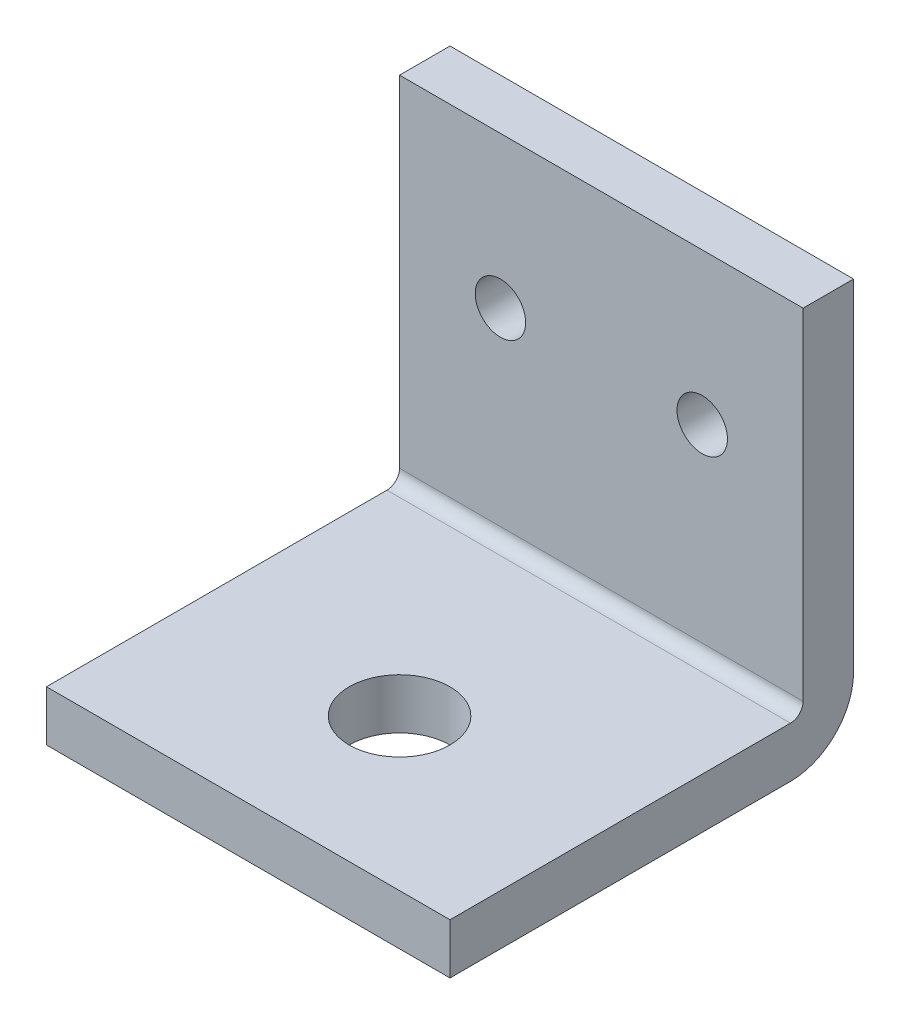
ISO-10303-21;
HEADER;
FILE_DESCRIPTION(('STEP AP214'),'2;1');
FILE_NAME('part.step','',(''),(''),'','','');
FILE_SCHEMA(('AUTOMOTIVE_DESIGN { 1 0 10303 214 1 1 1 1 }'));
ENDSEC;
DATA;
#1=APPLICATION_CONTEXT('core data for automotive mechanical design processes');
#2=APPLICATION_PROTOCOL_DEFINITION('international standard','automotive_design',2000,#1);
#3=PRODUCT_CONTEXT('',#1,'mechanical');
#4=PRODUCT('Part','Part','',(#3));
#5=PRODUCT_RELATED_PRODUCT_CATEGORY('part','',(#4));
#6=PRODUCT_DEFINITION_FORMATION('','',#4);
#7=PRODUCT_DEFINITION_CONTEXT('part definition',#1,'design');
#8=PRODUCT_DEFINITION('design','',#6,#7);
#9=PRODUCT_DEFINITION_SHAPE('','',#8);
#10=(LENGTH_UNIT() NAMED_UNIT(*) SI_UNIT(.MILLI.,.METRE.));
#11=(NAMED_UNIT(*) PLANE_ANGLE_UNIT() SI_UNIT($,.RADIAN.));
#12=(NAMED_UNIT(*) SI_UNIT($,.STERADIAN.) SOLID_ANGLE_UNIT());
#13=UNCERTAINTY_MEASURE_WITH_UNIT(LENGTH_MEASURE(1.E-05),#10,'distance_accuracy_value','');
#14=(GEOMETRIC_REPRESENTATION_CONTEXT(3) GLOBAL_UNCERTAINTY_ASSIGNED_CONTEXT((#13)) GLOBAL_UNIT_ASSIGNED_CONTEXT((#10,
#11,#12)) REPRESENTATION_CONTEXT('',''));
#15=CARTESIAN_POINT('',(0.,0.,0.));
#16=DIRECTION('',(0.,0.,1.));
#17=DIRECTION('',(1.,0.,0.));
#18=AXIS2_PLACEMENT_3D('',#15,#16,#17);
#19=CARTESIAN_POINT('',(20.,5.,-20.));
#20=DIRECTION('',(-1.,0.,0.));
#21=DIRECTION('',(0.,0.,1.));
#22=AXIS2_PLACEMENT_3D('',#19,#20,#21);
#23=PLANE('',#22);
#24=DIRECTION('',(0.,0.,-1.));
#25=VECTOR('',#24,1.);
#26=CARTESIAN_POINT('',(20.,0.,-20.));
#27=LINE('',#26,#25);
#28=CARTESIAN_POINT('',(20.,0.,20.));
#29=VERTEX_POINT('',#28);
#30=CARTESIAN_POINT('',(20.,0.,-13.75));
#31=VERTEX_POINT('',#30);
#32=EDGE_CURVE('E127',#29,#31,#27,.T.);
#33=ORIENTED_EDGE('',*,*,#32,.T.);
#34=CARTESIAN_POINT('',(20.,6.25,-13.75));
#35=DIRECTION('',(-1.,0.,0.));
#36=DIRECTION('',(0.,0.,1.));
#37=AXIS2_PLACEMENT_3D('',#34,#35,#36);
#38=CIRCLE('',#37,6.25);
#39=CARTESIAN_POINT('',(20.,6.25,-20.));
#40=VERTEX_POINT('',#39);
#41=EDGE_CURVE('E11',#31,#40,#38,.F.);
#42=ORIENTED_EDGE('',*,*,#41,.T.);
#43=DIRECTION('',(0.,-1.,0.));
#44=VECTOR('',#43,1.);
#45=CARTESIAN_POINT('',(20.,5.,-20.));
#46=LINE('',#45,#44);
#47=CARTESIAN_POINT('',(20.,40.,-20.));
#48=VERTEX_POINT('',#47);
#49=EDGE_CURVE('E152',#48,#40,#46,.T.);
#50=ORIENTED_EDGE('',*,*,#49,.F.);
#51=DIRECTION('',(0.,0.,-1.));
#52=VECTOR('',#51,1.);
#53=CARTESIAN_POINT('',(20.,40.,-20.));
#54=LINE('',#53,#52);
#55=CARTESIAN_POINT('',(20.,40.,-15.));
#56=VERTEX_POINT('',#55);
#57=EDGE_CURVE('E113',#56,#48,#54,.T.);
#58=ORIENTED_EDGE('',*,*,#57,.F.);
#59=DIRECTION('',(0.,-1.,0.));
#60=VECTOR('',#59,1.);
#61=CARTESIAN_POINT('',(20.,40.,-15.));
#62=LINE('',#61,#60);
#63=CARTESIAN_POINT('',(20.,6.25,-15.));
#64=VERTEX_POINT('',#63);
#65=EDGE_CURVE('E109',#56,#64,#62,.T.);
#66=ORIENTED_EDGE('',*,*,#65,.T.);
#67=CARTESIAN_POINT('',(20.,6.25,-13.75));
#68=DIRECTION('',(-1.,0.,0.));
#69=DIRECTION('',(0.,0.,1.));
#70=AXIS2_PLACEMENT_3D('',#67,#68,#69);
#71=CIRCLE('',#70,1.25);
#72=CARTESIAN_POINT('',(20.,5.,-13.75));
#73=VERTEX_POINT('',#72);
#74=EDGE_CURVE('E162',#64,#73,#71,.T.);
#75=ORIENTED_EDGE('',*,*,#74,.T.);
#76=DIRECTION('',(0.,0.,-1.));
#77=VECTOR('',#76,1.);
#78=CARTESIAN_POINT('',(20.,5.,-20.));
#79=LINE('',#78,#77);
#80=CARTESIAN_POINT('',(20.,5.,20.));
#81=VERTEX_POINT('',#80);
#82=EDGE_CURVE('E134',#81,#73,#79,.T.);
#83=ORIENTED_EDGE('',*,*,#82,.F.);
#84=DIRECTION('',(0.,-1.,0.));
#85=VECTOR('',#84,1.);
#86=CARTESIAN_POINT('',(20.,5.,20.));
#87=LINE('',#86,#85);
#88=EDGE_CURVE('E141',#81,#29,#87,.T.);
#89=ORIENTED_EDGE('',*,*,#88,.T.);
#90=EDGE_LOOP('',(#33,#42,#50,#58,#66,#75,#83,#89));
#91=FACE_BOUND('',#90,.T.);
#92=ADVANCED_FACE('F37',(#91),#23,.F.);
#93=CARTESIAN_POINT('',(-20.,5.,-20.));
#94=DIRECTION('',(0.,0.,1.));
#95=DIRECTION('',(1.,0.,0.));
#96=AXIS2_PLACEMENT_3D('',#93,#94,#95);
#97=PLANE('',#96);
#98=CARTESIAN_POINT('',(-9.99999999999999,25.,-20.));
#99=DIRECTION('',(0.,0.,1.));
#100=DIRECTION('',(1.,0.,0.));
#101=AXIS2_PLACEMENT_3D('',#98,#99,#100);
#102=CIRCLE('',#101,2.5);
#103=CARTESIAN_POINT('',(-7.49999999999999,25.,-20.));
#104=VERTEX_POINT('',#103);
#105=EDGE_CURVE('E190',#104,#104,#102,.T.);
#106=ORIENTED_EDGE('',*,*,#105,.T.);
#107=EDGE_LOOP('',(#106));
#108=FACE_BOUND('',#107,.T.);
#109=CARTESIAN_POINT('',(10.,25.,-20.));
#110=DIRECTION('',(0.,0.,1.));
#111=DIRECTION('',(1.,0.,0.));
#112=AXIS2_PLACEMENT_3D('',#109,#110,#111);
#113=CIRCLE('',#112,2.5);
#114=CARTESIAN_POINT('',(12.5,25.,-20.));
#115=VERTEX_POINT('',#114);
#116=EDGE_CURVE('E193',#115,#115,#113,.T.);
#117=ORIENTED_EDGE('',*,*,#116,.T.);
#118=EDGE_LOOP('',(#117));
#119=FACE_BOUND('',#118,.T.);
#120=ORIENTED_EDGE('',*,*,#49,.T.);
#121=DIRECTION('',(-1.,0.,0.));
#122=VECTOR('',#121,1.);
#123=CARTESIAN_POINT('',(-20.,6.25,-20.));
#124=LINE('',#123,#122);
#125=CARTESIAN_POINT('',(-20.,6.25,-20.));
#126=VERTEX_POINT('',#125);
#127=EDGE_CURVE('E165',#40,#126,#124,.T.);
#128=ORIENTED_EDGE('',*,*,#127,.T.);
#129=DIRECTION('',(0.,-1.,0.));
#130=VECTOR('',#129,1.);
#131=CARTESIAN_POINT('',(-20.,5.,-20.));
#132=LINE('',#131,#130);
#133=CARTESIAN_POINT('',(-20.,40.,-20.));
#134=VERTEX_POINT('',#133);
#135=EDGE_CURVE('E150',#134,#126,#132,.T.);
#136=ORIENTED_EDGE('',*,*,#135,.F.);
#137=DIRECTION('',(-1.,0.,0.));
#138=VECTOR('',#137,1.);
#139=CARTESIAN_POINT('',(-20.,40.,-20.));
#140=LINE('',#139,#138);
#141=EDGE_CURVE('E120',#48,#134,#140,.T.);
#142=ORIENTED_EDGE('',*,*,#141,.F.);
#143=EDGE_LOOP('',(#120,#128,#136,#142));
#144=FACE_BOUND('',#143,.T.);
#145=ADVANCED_FACE('F170',(#108,#119,#144),#97,.F.);
#146=CARTESIAN_POINT('',(-20.,5.,-20.));
#147=DIRECTION('',(1.,0.,0.));
#148=DIRECTION('',(0.,0.,-1.));
#149=AXIS2_PLACEMENT_3D('',#146,#147,#148);
#150=PLANE('',#149);
#151=ORIENTED_EDGE('',*,*,#135,.T.);
#152=CARTESIAN_POINT('',(-20.,6.25,-13.75));
#153=DIRECTION('',(1.,0.,0.));
#154=DIRECTION('',(0.,0.,-1.));
#155=AXIS2_PLACEMENT_3D('',#152,#153,#154);
#156=CIRCLE('',#155,6.25);
#157=CARTESIAN_POINT('',(-20.,0.,-13.75));
#158=VERTEX_POINT('',#157);
#159=EDGE_CURVE('E59',#126,#158,#156,.F.);
#160=ORIENTED_EDGE('',*,*,#159,.T.);
#161=DIRECTION('',(0.,0.,1.));
#162=VECTOR('',#161,1.);
#163=CARTESIAN_POINT('',(-20.,0.,-20.));
#164=LINE('',#163,#162);
#165=CARTESIAN_POINT('',(-20.,0.,20.));
#166=VERTEX_POINT('',#165);
#167=EDGE_CURVE('E129',#158,#166,#164,.T.);
#168=ORIENTED_EDGE('',*,*,#167,.T.);
#169=DIRECTION('',(0.,-1.,0.));
#170=VECTOR('',#169,1.);
#171=CARTESIAN_POINT('',(-20.,5.,20.));
#172=LINE('',#171,#170);
#173=CARTESIAN_POINT('',(-20.,5.,20.));
#174=VERTEX_POINT('',#173);
#175=EDGE_CURVE('E147',#174,#166,#172,.T.);
#176=ORIENTED_EDGE('',*,*,#175,.F.);
#177=DIRECTION('',(0.,0.,1.));
#178=VECTOR('',#177,1.);
#179=CARTESIAN_POINT('',(-20.,5.,-20.));
#180=LINE('',#179,#178);
#181=CARTESIAN_POINT('',(-20.,5.,-13.75));
#182=VERTEX_POINT('',#181);
#183=EDGE_CURVE('E137',#182,#174,#180,.T.);
#184=ORIENTED_EDGE('',*,*,#183,.F.);
#185=CARTESIAN_POINT('',(-20.,6.25,-13.75));
#186=DIRECTION('',(1.,0.,0.));
#187=DIRECTION('',(0.,0.,-1.));
#188=AXIS2_PLACEMENT_3D('',#185,#186,#187);
#189=CIRCLE('',#188,1.25);
#190=CARTESIAN_POINT('',(-20.,6.25,-15.));
#191=VERTEX_POINT('',#190);
#192=EDGE_CURVE('E126',#182,#191,#189,.T.);
#193=ORIENTED_EDGE('',*,*,#192,.T.);
#194=DIRECTION('',(0.,-1.,0.));
#195=VECTOR('',#194,1.);
#196=CARTESIAN_POINT('',(-20.,40.,-15.));
#197=LINE('',#196,#195);
#198=CARTESIAN_POINT('',(-20.,40.,-15.));
#199=VERTEX_POINT('',#198);
#200=EDGE_CURVE('E106',#199,#191,#197,.T.);
#201=ORIENTED_EDGE('',*,*,#200,.F.);
#202=DIRECTION('',(0.,0.,1.));
#203=VECTOR('',#202,1.);
#204=CARTESIAN_POINT('',(-20.,40.,-20.));
#205=LINE('',#204,#203);
#206=EDGE_CURVE('E114',#134,#199,#205,.T.);
#207=ORIENTED_EDGE('',*,*,#206,.F.);
#208=EDGE_LOOP('',(#151,#160,#168,#176,#184,#193,#201,#207));
#209=FACE_BOUND('',#208,.T.);
#210=ADVANCED_FACE('F123',(#209),#150,.F.);
#211=CARTESIAN_POINT('',(-20.,5.,20.));
#212=DIRECTION('',(0.,0.,-1.));
#213=DIRECTION('',(-1.,0.,0.));
#214=AXIS2_PLACEMENT_3D('',#211,#212,#213);
#215=PLANE('',#214);
#216=DIRECTION('',(1.,0.,0.));
#217=VECTOR('',#216,1.);
#218=CARTESIAN_POINT('',(-20.,0.,20.));
#219=LINE('',#218,#217);
#220=EDGE_CURVE('E138',#166,#29,#219,.T.);
#221=ORIENTED_EDGE('',*,*,#220,.T.);
#222=ORIENTED_EDGE('',*,*,#88,.F.);
#223=DIRECTION('',(1.,0.,0.));
#224=VECTOR('',#223,1.);
#225=CARTESIAN_POINT('',(-20.,5.,20.));
#226=LINE('',#225,#224);
#227=EDGE_CURVE('E140',#174,#81,#226,.T.);
#228=ORIENTED_EDGE('',*,*,#227,.F.);
#229=ORIENTED_EDGE('',*,*,#175,.T.);
#230=EDGE_LOOP('',(#221,#222,#228,#229));
#231=FACE_BOUND('',#230,.T.);
#232=ADVANCED_FACE('F179',(#231),#215,.F.);
#233=CARTESIAN_POINT('',(0.,5.,0.));
#234=DIRECTION('',(0.,1.,0.));
#235=DIRECTION('',(0.,0.,1.));
#236=AXIS2_PLACEMENT_3D('',#233,#234,#235);
#237=PLANE('',#236);
#238=CARTESIAN_POINT('',(0.,5.,5.));
#239=DIRECTION('',(0.,1.,0.));
#240=DIRECTION('',(0.,0.,1.));
#241=AXIS2_PLACEMENT_3D('',#238,#239,#240);
#242=CIRCLE('',#241,5.);
#243=CARTESIAN_POINT('',(0.,5.,10.));
#244=VERTEX_POINT('',#243);
#245=EDGE_CURVE('E158',#244,#244,#242,.T.);
#246=ORIENTED_EDGE('',*,*,#245,.F.);
#247=EDGE_LOOP('',(#246));
#248=FACE_BOUND('',#247,.T.);
#249=ORIENTED_EDGE('',*,*,#82,.T.);
#250=DIRECTION('',(1.,0.,0.));
#251=VECTOR('',#250,1.);
#252=CARTESIAN_POINT('',(0.,5.,-13.75));
#253=LINE('',#252,#251);
#254=EDGE_CURVE('E160',#73,#182,#253,.F.);
#255=ORIENTED_EDGE('',*,*,#254,.T.);
#256=ORIENTED_EDGE('',*,*,#183,.T.);
#257=ORIENTED_EDGE('',*,*,#227,.T.);
#258=EDGE_LOOP('',(#249,#255,#256,#257));
#259=FACE_BOUND('',#258,.T.);
#260=ADVANCED_FACE('F242',(#248,#259),#237,.T.);
#261=CARTESIAN_POINT('',(0.,0.,0.));
#262=DIRECTION('',(0.,1.,0.));
#263=DIRECTION('',(0.,0.,1.));
#264=AXIS2_PLACEMENT_3D('',#261,#262,#263);
#265=PLANE('',#264);
#266=CARTESIAN_POINT('',(0.,0.,5.));
#267=DIRECTION('',(0.,1.,0.));
#268=DIRECTION('',(0.,0.,1.));
#269=AXIS2_PLACEMENT_3D('',#266,#267,#268);
#270=CIRCLE('',#269,5.);
#271=CARTESIAN_POINT('',(0.,0.,10.));
#272=VERTEX_POINT('',#271);
#273=EDGE_CURVE('E121',#272,#272,#270,.T.);
#274=ORIENTED_EDGE('',*,*,#273,.T.);
#275=EDGE_LOOP('',(#274));
#276=FACE_BOUND('',#275,.T.);
#277=ORIENTED_EDGE('',*,*,#167,.F.);
#278=DIRECTION('',(-1.,0.,0.));
#279=VECTOR('',#278,1.);
#280=CARTESIAN_POINT('',(0.,0.,-13.75));
#281=LINE('',#280,#279);
#282=EDGE_CURVE('E45',#158,#31,#281,.F.);
#283=ORIENTED_EDGE('',*,*,#282,.T.);
#284=ORIENTED_EDGE('',*,*,#32,.F.);
#285=ORIENTED_EDGE('',*,*,#220,.F.);
#286=EDGE_LOOP('',(#277,#283,#284,#285));
#287=FACE_BOUND('',#286,.T.);
#288=ADVANCED_FACE('F177',(#276,#287),#265,.F.);
#289=CARTESIAN_POINT('',(-20.,40.,-15.));
#290=DIRECTION('',(0.,0.,-1.));
#291=DIRECTION('',(-1.,0.,0.));
#292=AXIS2_PLACEMENT_3D('',#289,#290,#291);
#293=PLANE('',#292);
#294=CARTESIAN_POINT('',(-9.99999999999999,25.,-15.));
#295=DIRECTION('',(0.,0.,1.));
#296=DIRECTION('',(1.,0.,0.));
#297=AXIS2_PLACEMENT_3D('',#294,#295,#296);
#298=CIRCLE('',#297,2.5);
#299=CARTESIAN_POINT('',(-7.49999999999999,25.,-15.));
#300=VERTEX_POINT('',#299);
#301=EDGE_CURVE('E196',#300,#300,#298,.T.);
#302=ORIENTED_EDGE('',*,*,#301,.F.);
#303=EDGE_LOOP('',(#302));
#304=FACE_BOUND('',#303,.T.);
#305=CARTESIAN_POINT('',(10.,25.,-15.));
#306=DIRECTION('',(0.,0.,1.));
#307=DIRECTION('',(1.,0.,0.));
#308=AXIS2_PLACEMENT_3D('',#305,#306,#307);
#309=CIRCLE('',#308,2.5);
#310=CARTESIAN_POINT('',(12.5,25.,-15.));
#311=VERTEX_POINT('',#310);
#312=EDGE_CURVE('E197',#311,#311,#309,.T.);
#313=ORIENTED_EDGE('',*,*,#312,.F.);
#314=EDGE_LOOP('',(#313));
#315=FACE_BOUND('',#314,.T.);
#316=ORIENTED_EDGE('',*,*,#200,.T.);
#317=DIRECTION('',(1.,0.,0.));
#318=VECTOR('',#317,1.);
#319=CARTESIAN_POINT('',(-20.,6.25,-15.));
#320=LINE('',#319,#318);
#321=EDGE_CURVE('E155',#191,#64,#320,.T.);
#322=ORIENTED_EDGE('',*,*,#321,.T.);
#323=ORIENTED_EDGE('',*,*,#65,.F.);
#324=DIRECTION('',(1.,0.,0.));
#325=VECTOR('',#324,1.);
#326=CARTESIAN_POINT('',(-20.,40.,-15.));
#327=LINE('',#326,#325);
#328=EDGE_CURVE('E101',#199,#56,#327,.T.);
#329=ORIENTED_EDGE('',*,*,#328,.F.);
#330=EDGE_LOOP('',(#316,#322,#323,#329));
#331=FACE_BOUND('',#330,.T.);
#332=ADVANCED_FACE('F103',(#304,#315,#331),#293,.F.);
#333=CARTESIAN_POINT('',(0.,40.,0.));
#334=DIRECTION('',(0.,1.,0.));
#335=DIRECTION('',(0.,0.,1.));
#336=AXIS2_PLACEMENT_3D('',#333,#334,#335);
#337=PLANE('',#336);
#338=ORIENTED_EDGE('',*,*,#206,.T.);
#339=ORIENTED_EDGE('',*,*,#328,.T.);
#340=ORIENTED_EDGE('',*,*,#57,.T.);
#341=ORIENTED_EDGE('',*,*,#141,.T.);
#342=EDGE_LOOP('',(#338,#339,#340,#341));
#343=FACE_BOUND('',#342,.T.);
#344=ADVANCED_FACE('F118',(#343),#337,.T.);
#345=CARTESIAN_POINT('',(0.,-30.,5.));
#346=DIRECTION('',(0.,1.,0.));
#347=DIRECTION('',(0.,0.,1.));
#348=AXIS2_PLACEMENT_3D('',#345,#346,#347);
#349=CYLINDRICAL_SURFACE('',#348,5.);
#350=ORIENTED_EDGE('',*,*,#245,.T.);
#351=EDGE_LOOP('',(#350));
#352=FACE_BOUND('',#351,.T.);
#353=ORIENTED_EDGE('',*,*,#273,.F.);
#354=EDGE_LOOP('',(#353));
#355=FACE_BOUND('',#354,.T.);
#356=ADVANCED_FACE('F214',(#352,#355),#349,.F.);
#357=CARTESIAN_POINT('',(10.,25.,-50.));
#358=DIRECTION('',(0.,0.,1.));
#359=DIRECTION('',(1.,0.,0.));
#360=AXIS2_PLACEMENT_3D('',#357,#358,#359);
#361=CYLINDRICAL_SURFACE('',#360,2.5);
#362=ORIENTED_EDGE('',*,*,#312,.T.);
#363=EDGE_LOOP('',(#362));
#364=FACE_BOUND('',#363,.T.);
#365=ORIENTED_EDGE('',*,*,#116,.F.);
#366=EDGE_LOOP('',(#365));
#367=FACE_BOUND('',#366,.T.);
#368=ADVANCED_FACE('F211',(#364,#367),#361,.F.);
#369=CARTESIAN_POINT('',(-9.99999999999999,25.,-50.));
#370=DIRECTION('',(0.,0.,1.));
#371=DIRECTION('',(1.,0.,0.));
#372=AXIS2_PLACEMENT_3D('',#369,#370,#371);
#373=CYLINDRICAL_SURFACE('',#372,2.5);
#374=ORIENTED_EDGE('',*,*,#301,.T.);
#375=EDGE_LOOP('',(#374));
#376=FACE_BOUND('',#375,.T.);
#377=ORIENTED_EDGE('',*,*,#105,.F.);
#378=EDGE_LOOP('',(#377));
#379=FACE_BOUND('',#378,.T.);
#380=ADVANCED_FACE('F203',(#376,#379),#373,.F.);
#381=CARTESIAN_POINT('',(-20.,6.25,-13.75));
#382=DIRECTION('',(1.,0.,0.));
#383=DIRECTION('',(0.,0.,-1.));
#384=AXIS2_PLACEMENT_3D('',#381,#382,#383);
#385=CYLINDRICAL_SURFACE('',#384,1.25);
#386=ORIENTED_EDGE('',*,*,#192,.F.);
#387=ORIENTED_EDGE('',*,*,#254,.F.);
#388=ORIENTED_EDGE('',*,*,#74,.F.);
#389=ORIENTED_EDGE('',*,*,#321,.F.);
#390=EDGE_LOOP('',(#386,#387,#388,#389));
#391=FACE_BOUND('',#390,.T.);
#392=ADVANCED_FACE('F185',(#391),#385,.F.);
#393=CARTESIAN_POINT('',(-20.,6.25,-13.75));
#394=DIRECTION('',(-1.,0.,0.));
#395=DIRECTION('',(0.,0.,1.));
#396=AXIS2_PLACEMENT_3D('',#393,#394,#395);
#397=CYLINDRICAL_SURFACE('',#396,6.25);
#398=ORIENTED_EDGE('',*,*,#41,.F.);
#399=ORIENTED_EDGE('',*,*,#282,.F.);
#400=ORIENTED_EDGE('',*,*,#159,.F.);
#401=ORIENTED_EDGE('',*,*,#127,.F.);
#402=EDGE_LOOP('',(#398,#399,#400,#401));
#403=FACE_BOUND('',#402,.T.);
#404=ADVANCED_FACE('F39',(#403),#397,.T.);
#405=CLOSED_SHELL('',(#92,#145,#210,#232,#260,#288,#332,#344,#356,#368,#380,#392,#404));
#406=MANIFOLD_SOLID_BREP('B2',#405);
#407=ADVANCED_BREP_SHAPE_REPRESENTATION('',(#18,#406),#14);
#408=SHAPE_DEFINITION_REPRESENTATION(#9,#407);
ENDSEC;
END-ISO-10303-21;
